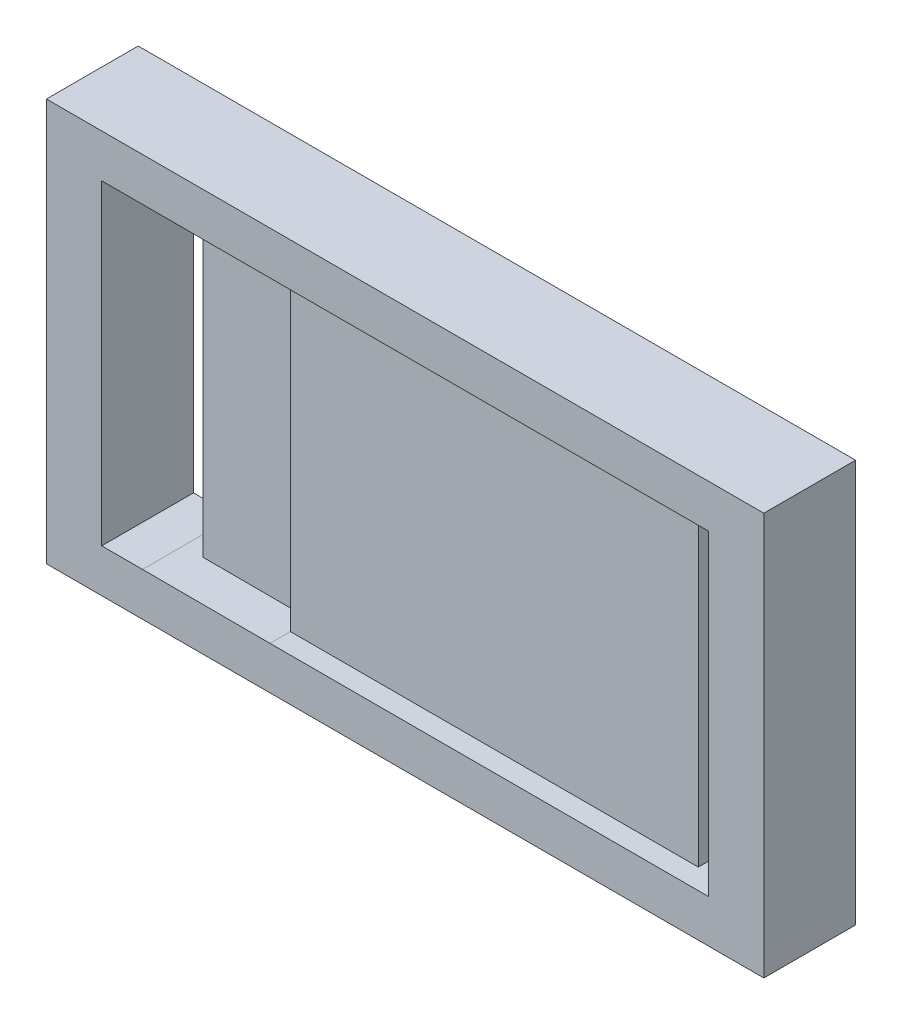
ISO-10303-21;
HEADER;
FILE_DESCRIPTION(('STEP AP214'),'2;1');
FILE_NAME('part.step','',(''),(''),'','','');
FILE_SCHEMA(('AUTOMOTIVE_DESIGN { 1 0 10303 214 1 1 1 1 }'));
ENDSEC;
DATA;
#1=APPLICATION_CONTEXT('core data for automotive mechanical design processes');
#2=APPLICATION_PROTOCOL_DEFINITION('international standard','automotive_design',2000,#1);
#3=PRODUCT_CONTEXT('',#1,'mechanical');
#4=PRODUCT('Part','Part','',(#3));
#5=PRODUCT_RELATED_PRODUCT_CATEGORY('part','',(#4));
#6=PRODUCT_DEFINITION_FORMATION('','',#4);
#7=PRODUCT_DEFINITION_CONTEXT('part definition',#1,'design');
#8=PRODUCT_DEFINITION('design','',#6,#7);
#9=PRODUCT_DEFINITION_SHAPE('','',#8);
#10=(LENGTH_UNIT() NAMED_UNIT(*) SI_UNIT(.MILLI.,.METRE.));
#11=(NAMED_UNIT(*) PLANE_ANGLE_UNIT() SI_UNIT($,.RADIAN.));
#12=(NAMED_UNIT(*) SI_UNIT($,.STERADIAN.) SOLID_ANGLE_UNIT());
#13=UNCERTAINTY_MEASURE_WITH_UNIT(LENGTH_MEASURE(1.E-05),#10,'distance_accuracy_value','');
#14=(GEOMETRIC_REPRESENTATION_CONTEXT(3) GLOBAL_UNCERTAINTY_ASSIGNED_CONTEXT((#13)) GLOBAL_UNIT_ASSIGNED_CONTEXT((#10,
#11,#12)) REPRESENTATION_CONTEXT('',''));
#15=CARTESIAN_POINT('',(0.,0.,0.));
#16=DIRECTION('',(0.,0.,1.));
#17=DIRECTION('',(1.,0.,0.));
#18=AXIS2_PLACEMENT_3D('',#15,#16,#17);
#19=CARTESIAN_POINT('',(-59.5,-31.,-8.));
#20=DIRECTION('',(0.,-1.,0.));
#21=DIRECTION('',(0.,0.,-1.));
#22=AXIS2_PLACEMENT_3D('',#19,#20,#21);
#23=PLANE('',#22);
#24=DIRECTION('',(1.,0.,0.));
#25=VECTOR('',#24,1.);
#26=CARTESIAN_POINT('',(-59.5,-31.,-8.));
#27=LINE('',#26,#25);
#28=CARTESIAN_POINT('',(59.4984198491784,-31.,-8.));
#29=VERTEX_POINT('',#28);
#30=CARTESIAN_POINT('',(59.5,-31.,-8.));
#31=VERTEX_POINT('',#30);
#32=EDGE_CURVE('E263',#29,#31,#27,.T.);
#33=ORIENTED_EDGE('',*,*,#32,.F.);
#34=DIRECTION('',(0.,0.,1.));
#35=VECTOR('',#34,1.);
#36=CARTESIAN_POINT('',(59.4984198491784,-31.,-8.));
#37=LINE('',#36,#35);
#38=CARTESIAN_POINT('',(59.4984198491784,-31.,0.));
#39=VERTEX_POINT('',#38);
#40=EDGE_CURVE('E357',#29,#39,#37,.T.);
#41=ORIENTED_EDGE('',*,*,#40,.T.);
#42=DIRECTION('',(1.,0.,0.));
#43=VECTOR('',#42,1.);
#44=CARTESIAN_POINT('',(59.5,-31.,0.));
#45=LINE('',#44,#43);
#46=CARTESIAN_POINT('',(59.5,-31.,0.));
#47=VERTEX_POINT('',#46);
#48=EDGE_CURVE('E228',#39,#47,#45,.T.);
#49=ORIENTED_EDGE('',*,*,#48,.T.);
#50=DIRECTION('',(0.,0.,1.));
#51=VECTOR('',#50,1.);
#52=CARTESIAN_POINT('',(59.5,-31.,-8.));
#53=LINE('',#52,#51);
#54=EDGE_CURVE('E269',#31,#47,#53,.T.);
#55=ORIENTED_EDGE('',*,*,#54,.F.);
#56=EDGE_LOOP('',(#33,#41,#49,#55));
#57=FACE_BOUND('',#56,.T.);
#58=ADVANCED_FACE('F41',(#57),#23,.F.);
#59=CARTESIAN_POINT('',(0.,0.,0.));
#60=DIRECTION('',(0.,0.,-1.));
#61=DIRECTION('',(-1.,0.,0.));
#62=AXIS2_PLACEMENT_3D('',#59,#60,#61);
#63=PLANE('',#62);
#64=DIRECTION('',(0.,-1.,0.));
#65=VECTOR('',#64,1.);
#66=CARTESIAN_POINT('',(59.4984198491784,0.,0.));
#67=LINE('',#66,#65);
#68=CARTESIAN_POINT('',(59.4984198491784,31.,0.));
#69=VERTEX_POINT('',#68);
#70=EDGE_CURVE('E11',#69,#39,#67,.T.);
#71=ORIENTED_EDGE('',*,*,#70,.F.);
#72=DIRECTION('',(-1.,0.,0.));
#73=VECTOR('',#72,1.);
#74=CARTESIAN_POINT('',(-51.5,31.,0.));
#75=LINE('',#74,#73);
#76=CARTESIAN_POINT('',(59.5,31.,0.));
#77=VERTEX_POINT('',#76);
#78=EDGE_CURVE('E225',#77,#69,#75,.T.);
#79=ORIENTED_EDGE('',*,*,#78,.F.);
#80=DIRECTION('',(0.,1.,0.));
#81=VECTOR('',#80,1.);
#82=CARTESIAN_POINT('',(59.5,31.,0.));
#83=LINE('',#82,#81);
#84=EDGE_CURVE('E232',#47,#77,#83,.T.);
#85=ORIENTED_EDGE('',*,*,#84,.F.);
#86=ORIENTED_EDGE('',*,*,#48,.F.);
#87=EDGE_LOOP('',(#71,#79,#85,#86));
#88=FACE_BOUND('',#87,.T.);
#89=ADVANCED_FACE('F397',(#88),#63,.T.);
#90=CARTESIAN_POINT('',(-47.6036139428101,-31.,0.));
#91=VERTEX_POINT('',#90);
#92=CARTESIAN_POINT('',(53.4984198491784,-31.,0.));
#93=VERTEX_POINT('',#92);
#94=EDGE_CURVE('E229',#91,#93,#45,.T.);
#95=ORIENTED_EDGE('',*,*,#94,.T.);
#96=DIRECTION('',(0.,0.,-1.));
#97=VECTOR('',#96,1.);
#98=CARTESIAN_POINT('',(53.4984198491784,-31.,-8.));
#99=LINE('',#98,#97);
#100=CARTESIAN_POINT('',(53.4984198491784,-31.,-8.));
#101=VERTEX_POINT('',#100);
#102=EDGE_CURVE('E303',#93,#101,#99,.T.);
#103=ORIENTED_EDGE('',*,*,#102,.T.);
#104=CARTESIAN_POINT('',(-47.6036139428101,-31.,-8.));
#105=VERTEX_POINT('',#104);
#106=EDGE_CURVE('E268',#105,#101,#27,.T.);
#107=ORIENTED_EDGE('',*,*,#106,.F.);
#108=DIRECTION('',(0.,0.,1.));
#109=VECTOR('',#108,1.);
#110=CARTESIAN_POINT('',(-47.6036139428101,-31.,-8.));
#111=LINE('',#110,#109);
#112=EDGE_CURVE('E322',#105,#91,#111,.T.);
#113=ORIENTED_EDGE('',*,*,#112,.T.);
#114=EDGE_LOOP('',(#95,#103,#107,#113));
#115=FACE_BOUND('',#114,.T.);
#116=ADVANCED_FACE('F370',(#115),#23,.F.);
#117=DIRECTION('',(0.,0.,-1.));
#118=VECTOR('',#117,1.);
#119=CARTESIAN_POINT('',(-51.5,-31.,10.));
#120=LINE('',#119,#118);
#121=CARTESIAN_POINT('',(-51.5,-31.,10.));
#122=VERTEX_POINT('',#121);
#123=CARTESIAN_POINT('',(-51.5,-31.,-8.));
#124=VERTEX_POINT('',#123);
#125=EDGE_CURVE('E234',#122,#124,#120,.T.);
#126=ORIENTED_EDGE('',*,*,#125,.T.);
#127=CARTESIAN_POINT('',(-59.5,-31.,-8.));
#128=VERTEX_POINT('',#127);
#129=EDGE_CURVE('E264',#128,#124,#27,.T.);
#130=ORIENTED_EDGE('',*,*,#129,.F.);
#131=DIRECTION('',(0.,0.,1.));
#132=VECTOR('',#131,1.);
#133=CARTESIAN_POINT('',(-59.5,-31.,-8.));
#134=LINE('',#133,#132);
#135=CARTESIAN_POINT('',(-59.5,-31.,10.));
#136=VERTEX_POINT('',#135);
#137=EDGE_CURVE('E273',#128,#136,#134,.T.);
#138=ORIENTED_EDGE('',*,*,#137,.T.);
#139=DIRECTION('',(1.,0.,0.));
#140=VECTOR('',#139,1.);
#141=CARTESIAN_POINT('',(-59.5,-31.,10.));
#142=LINE('',#141,#140);
#143=EDGE_CURVE('E240',#136,#122,#142,.T.);
#144=ORIENTED_EDGE('',*,*,#143,.T.);
#145=EDGE_LOOP('',(#126,#130,#138,#144));
#146=FACE_BOUND('',#145,.T.);
#147=ADVANCED_FACE('F390',(#146),#23,.F.);
#148=CARTESIAN_POINT('',(-59.5,31.,-8.));
#149=DIRECTION('',(0.,1.,0.));
#150=DIRECTION('',(0.,0.,1.));
#151=AXIS2_PLACEMENT_3D('',#148,#149,#150);
#152=PLANE('',#151);
#153=DIRECTION('',(0.,0.,1.));
#154=VECTOR('',#153,1.);
#155=CARTESIAN_POINT('',(59.4984198491784,31.,-8.));
#156=LINE('',#155,#154);
#157=CARTESIAN_POINT('',(59.4984198491784,31.,10.));
#158=VERTEX_POINT('',#157);
#159=EDGE_CURVE('E347',#69,#158,#156,.T.);
#160=ORIENTED_EDGE('',*,*,#159,.T.);
#161=DIRECTION('',(-1.,0.,0.));
#162=VECTOR('',#161,1.);
#163=CARTESIAN_POINT('',(-59.5,31.,10.));
#164=LINE('',#163,#162);
#165=CARTESIAN_POINT('',(-59.5,31.,10.));
#166=VERTEX_POINT('',#165);
#167=EDGE_CURVE('E56',#158,#166,#164,.T.);
#168=ORIENTED_EDGE('',*,*,#167,.T.);
#169=DIRECTION('',(0.,0.,1.));
#170=VECTOR('',#169,1.);
#171=CARTESIAN_POINT('',(-59.5,31.,-8.));
#172=LINE('',#171,#170);
#173=CARTESIAN_POINT('',(-59.5,31.,-8.));
#174=VERTEX_POINT('',#173);
#175=EDGE_CURVE('E275',#174,#166,#172,.T.);
#176=ORIENTED_EDGE('',*,*,#175,.F.);
#177=DIRECTION('',(-1.,0.,0.));
#178=VECTOR('',#177,1.);
#179=CARTESIAN_POINT('',(-59.5,31.,-8.));
#180=LINE('',#179,#178);
#181=CARTESIAN_POINT('',(59.5,31.,-8.));
#182=VERTEX_POINT('',#181);
#183=EDGE_CURVE('E258',#182,#174,#180,.T.);
#184=ORIENTED_EDGE('',*,*,#183,.F.);
#185=DIRECTION('',(0.,0.,1.));
#186=VECTOR('',#185,1.);
#187=CARTESIAN_POINT('',(59.5,31.,-8.));
#188=LINE('',#187,#186);
#189=EDGE_CURVE('E267',#182,#77,#188,.T.);
#190=ORIENTED_EDGE('',*,*,#189,.T.);
#191=ORIENTED_EDGE('',*,*,#78,.T.);
#192=EDGE_LOOP('',(#160,#168,#176,#184,#190,#191));
#193=FACE_BOUND('',#192,.T.);
#194=DIRECTION('',(0.,0.,1.));
#195=VECTOR('',#194,1.);
#196=CARTESIAN_POINT('',(-26.5,31.,2.));
#197=LINE('',#196,#195);
#198=CARTESIAN_POINT('',(-26.5,31.,2.));
#199=VERTEX_POINT('',#198);
#200=CARTESIAN_POINT('',(-26.5,31.,6.));
#201=VERTEX_POINT('',#200);
#202=EDGE_CURVE('E216',#199,#201,#197,.T.);
#203=ORIENTED_EDGE('',*,*,#202,.T.);
#204=DIRECTION('',(-1.,0.,0.));
#205=VECTOR('',#204,1.);
#206=CARTESIAN_POINT('',(-26.5,31.,6.));
#207=LINE('',#206,#205);
#208=CARTESIAN_POINT('',(53.4984198491784,31.,6.));
#209=VERTEX_POINT('',#208);
#210=EDGE_CURVE('E198',#209,#201,#207,.T.);
#211=ORIENTED_EDGE('',*,*,#210,.F.);
#212=DIRECTION('',(0.,0.,1.));
#213=VECTOR('',#212,1.);
#214=CARTESIAN_POINT('',(53.4984198491784,31.,-8.));
#215=LINE('',#214,#213);
#216=CARTESIAN_POINT('',(53.4984198491785,31.,0.));
#217=VERTEX_POINT('',#216);
#218=EDGE_CURVE('E64',#217,#209,#215,.T.);
#219=ORIENTED_EDGE('',*,*,#218,.F.);
#220=CARTESIAN_POINT('',(-47.6036139428101,31.,0.));
#221=VERTEX_POINT('',#220);
#222=EDGE_CURVE('E219',#217,#221,#75,.T.);
#223=ORIENTED_EDGE('',*,*,#222,.T.);
#224=DIRECTION('',(0.,0.,1.));
#225=VECTOR('',#224,1.);
#226=CARTESIAN_POINT('',(-47.6036139428101,31.,-8.));
#227=LINE('',#226,#225);
#228=CARTESIAN_POINT('',(-47.6036139428101,31.,2.));
#229=VERTEX_POINT('',#228);
#230=EDGE_CURVE('E312',#221,#229,#227,.T.);
#231=ORIENTED_EDGE('',*,*,#230,.T.);
#232=DIRECTION('',(-1.,0.,0.));
#233=VECTOR('',#232,1.);
#234=CARTESIAN_POINT('',(-51.5,31.,2.));
#235=LINE('',#234,#233);
#236=EDGE_CURVE('E217',#199,#229,#235,.T.);
#237=ORIENTED_EDGE('',*,*,#236,.F.);
#238=EDGE_LOOP('',(#203,#211,#219,#223,#231,#237));
#239=FACE_BOUND('',#238,.T.);
#240=ADVANCED_FACE('F310',(#193,#239),#152,.F.);
#241=CARTESIAN_POINT('',(70.3484198491784,-39.4741318523803,-8.));
#242=DIRECTION('',(1.,0.,0.));
#243=DIRECTION('',(0.,0.,-1.));
#244=AXIS2_PLACEMENT_3D('',#241,#242,#243);
#245=PLANE('',#244);
#246=DIRECTION('',(0.,0.,1.));
#247=VECTOR('',#246,1.);
#248=CARTESIAN_POINT('',(70.3484198491784,39.4741318523803,-8.));
#249=LINE('',#248,#247);
#250=CARTESIAN_POINT('',(70.3484198491784,39.4741318523803,-8.));
#251=VERTEX_POINT('',#250);
#252=CARTESIAN_POINT('',(70.3484198491784,39.4741318523803,10.));
#253=VERTEX_POINT('',#252);
#254=EDGE_CURVE('E291',#251,#253,#249,.T.);
#255=ORIENTED_EDGE('',*,*,#254,.T.);
#256=DIRECTION('',(0.,1.,0.));
#257=VECTOR('',#256,1.);
#258=CARTESIAN_POINT('',(70.3484198491784,-39.4741318523803,10.));
#259=LINE('',#258,#257);
#260=CARTESIAN_POINT('',(70.3484198491784,-39.4741318523803,10.));
#261=VERTEX_POINT('',#260);
#262=EDGE_CURVE('E243',#261,#253,#259,.T.);
#263=ORIENTED_EDGE('',*,*,#262,.F.);
#264=DIRECTION('',(0.,0.,1.));
#265=VECTOR('',#264,1.);
#266=CARTESIAN_POINT('',(70.3484198491784,-39.4741318523803,-8.));
#267=LINE('',#266,#265);
#268=CARTESIAN_POINT('',(70.3484198491784,-39.4741318523803,-8.));
#269=VERTEX_POINT('',#268);
#270=EDGE_CURVE('E292',#269,#261,#267,.T.);
#271=ORIENTED_EDGE('',*,*,#270,.F.);
#272=DIRECTION('',(0.,1.,0.));
#273=VECTOR('',#272,1.);
#274=CARTESIAN_POINT('',(70.3484198491784,-39.4741318523803,-8.));
#275=LINE('',#274,#273);
#276=EDGE_CURVE('E272',#269,#251,#275,.T.);
#277=ORIENTED_EDGE('',*,*,#276,.T.);
#278=EDGE_LOOP('',(#255,#263,#271,#277));
#279=FACE_BOUND('',#278,.T.);
#280=ADVANCED_FACE('F43',(#279),#245,.T.);
#281=CARTESIAN_POINT('',(-70.3484198491784,-39.4741318523803,-8.));
#282=DIRECTION('',(0.,-1.,0.));
#283=DIRECTION('',(0.,0.,-1.));
#284=AXIS2_PLACEMENT_3D('',#281,#282,#283);
#285=PLANE('',#284);
#286=ORIENTED_EDGE('',*,*,#270,.T.);
#287=DIRECTION('',(1.,0.,0.));
#288=VECTOR('',#287,1.);
#289=CARTESIAN_POINT('',(-70.3484198491784,-39.4741318523803,10.));
#290=LINE('',#289,#288);
#291=CARTESIAN_POINT('',(-70.3484198491784,-39.4741318523803,10.));
#292=VERTEX_POINT('',#291);
#293=EDGE_CURVE('E252',#292,#261,#290,.T.);
#294=ORIENTED_EDGE('',*,*,#293,.F.);
#295=DIRECTION('',(0.,0.,1.));
#296=VECTOR('',#295,1.);
#297=CARTESIAN_POINT('',(-70.3484198491784,-39.4741318523803,-8.));
#298=LINE('',#297,#296);
#299=CARTESIAN_POINT('',(-70.3484198491784,-39.4741318523803,-8.));
#300=VERTEX_POINT('',#299);
#301=EDGE_CURVE('E294',#300,#292,#298,.T.);
#302=ORIENTED_EDGE('',*,*,#301,.F.);
#303=DIRECTION('',(1.,0.,0.));
#304=VECTOR('',#303,1.);
#305=CARTESIAN_POINT('',(-70.3484198491784,-39.4741318523803,-8.));
#306=LINE('',#305,#304);
#307=EDGE_CURVE('E288',#300,#269,#306,.T.);
#308=ORIENTED_EDGE('',*,*,#307,.T.);
#309=EDGE_LOOP('',(#286,#294,#302,#308));
#310=FACE_BOUND('',#309,.T.);
#311=ADVANCED_FACE('F427',(#310),#285,.T.);
#312=CARTESIAN_POINT('',(-70.3484198491784,-39.4741318523803,-8.));
#313=DIRECTION('',(-1.,0.,0.));
#314=DIRECTION('',(0.,0.,1.));
#315=AXIS2_PLACEMENT_3D('',#312,#313,#314);
#316=PLANE('',#315);
#317=ORIENTED_EDGE('',*,*,#301,.T.);
#318=DIRECTION('',(0.,-1.,0.));
#319=VECTOR('',#318,1.);
#320=CARTESIAN_POINT('',(-70.3484198491784,-39.4741318523803,10.));
#321=LINE('',#320,#319);
#322=CARTESIAN_POINT('',(-70.3484198491784,39.4741318523803,10.));
#323=VERTEX_POINT('',#322);
#324=EDGE_CURVE('E249',#323,#292,#321,.T.);
#325=ORIENTED_EDGE('',*,*,#324,.F.);
#326=DIRECTION('',(0.,0.,1.));
#327=VECTOR('',#326,1.);
#328=CARTESIAN_POINT('',(-70.3484198491784,39.4741318523803,-8.));
#329=LINE('',#328,#327);
#330=CARTESIAN_POINT('',(-70.3484198491784,39.4741318523803,-8.));
#331=VERTEX_POINT('',#330);
#332=EDGE_CURVE('E296',#331,#323,#329,.T.);
#333=ORIENTED_EDGE('',*,*,#332,.F.);
#334=DIRECTION('',(0.,-1.,0.));
#335=VECTOR('',#334,1.);
#336=CARTESIAN_POINT('',(-70.3484198491784,-39.4741318523803,-8.));
#337=LINE('',#336,#335);
#338=EDGE_CURVE('E285',#331,#300,#337,.T.);
#339=ORIENTED_EDGE('',*,*,#338,.T.);
#340=EDGE_LOOP('',(#317,#325,#333,#339));
#341=FACE_BOUND('',#340,.T.);
#342=ADVANCED_FACE('F430',(#341),#316,.T.);
#343=CARTESIAN_POINT('',(-70.3484198491784,39.4741318523803,-8.));
#344=DIRECTION('',(0.,1.,0.));
#345=DIRECTION('',(0.,0.,1.));
#346=AXIS2_PLACEMENT_3D('',#343,#344,#345);
#347=PLANE('',#346);
#348=ORIENTED_EDGE('',*,*,#332,.T.);
#349=DIRECTION('',(-1.,0.,0.));
#350=VECTOR('',#349,1.);
#351=CARTESIAN_POINT('',(-70.3484198491784,39.4741318523803,10.));
#352=LINE('',#351,#350);
#353=EDGE_CURVE('E246',#253,#323,#352,.T.);
#354=ORIENTED_EDGE('',*,*,#353,.F.);
#355=ORIENTED_EDGE('',*,*,#254,.F.);
#356=DIRECTION('',(-1.,0.,0.));
#357=VECTOR('',#356,1.);
#358=CARTESIAN_POINT('',(-70.3484198491784,39.4741318523803,-8.));
#359=LINE('',#358,#357);
#360=EDGE_CURVE('E282',#251,#331,#359,.T.);
#361=ORIENTED_EDGE('',*,*,#360,.T.);
#362=EDGE_LOOP('',(#348,#354,#355,#361));
#363=FACE_BOUND('',#362,.T.);
#364=ADVANCED_FACE('F426',(#363),#347,.T.);
#365=CARTESIAN_POINT('',(0.,0.,-8.));
#366=DIRECTION('',(0.,0.,-1.));
#367=DIRECTION('',(-1.,0.,0.));
#368=AXIS2_PLACEMENT_3D('',#365,#366,#367);
#369=PLANE('',#368);
#370=DIRECTION('',(0.,1.,0.));
#371=VECTOR('',#370,1.);
#372=CARTESIAN_POINT('',(59.4984198491784,31.,-8.));
#373=LINE('',#372,#371);
#374=CARTESIAN_POINT('',(59.4984198491784,-31.0615588520916,-8.));
#375=VERTEX_POINT('',#374);
#376=EDGE_CURVE('E337',#375,#29,#373,.T.);
#377=ORIENTED_EDGE('',*,*,#376,.T.);
#378=ORIENTED_EDGE('',*,*,#32,.T.);
#379=DIRECTION('',(0.,1.,0.));
#380=VECTOR('',#379,1.);
#381=CARTESIAN_POINT('',(59.5,-31.,-8.));
#382=LINE('',#381,#380);
#383=EDGE_CURVE('E255',#31,#182,#382,.T.);
#384=ORIENTED_EDGE('',*,*,#383,.T.);
#385=ORIENTED_EDGE('',*,*,#183,.T.);
#386=DIRECTION('',(0.,-1.,0.));
#387=VECTOR('',#386,1.);
#388=CARTESIAN_POINT('',(-59.5,-31.,-8.));
#389=LINE('',#388,#387);
#390=EDGE_CURVE('E260',#174,#128,#389,.T.);
#391=ORIENTED_EDGE('',*,*,#390,.T.);
#392=ORIENTED_EDGE('',*,*,#129,.T.);
#393=DIRECTION('',(0.999996968419969,-0.00246234661883823,0.));
#394=VECTOR('',#393,1.);
#395=CARTESIAN_POINT('',(-47.6036139428101,-31.0095942821195,-8.));
#396=LINE('',#395,#394);
#397=CARTESIAN_POINT('',(-47.6036139428101,-31.0095942821195,-8.));
#398=VERTEX_POINT('',#397);
#399=EDGE_CURVE('E360',#124,#398,#396,.T.);
#400=ORIENTED_EDGE('',*,*,#399,.T.);
#401=DIRECTION('',(0.,1.,0.));
#402=VECTOR('',#401,1.);
#403=CARTESIAN_POINT('',(-47.6036139428101,31.,-8.));
#404=LINE('',#403,#402);
#405=EDGE_CURVE('E324',#398,#105,#404,.T.);
#406=ORIENTED_EDGE('',*,*,#405,.T.);
#407=ORIENTED_EDGE('',*,*,#106,.T.);
#408=DIRECTION('',(0.,-1.,0.));
#409=VECTOR('',#408,1.);
#410=CARTESIAN_POINT('',(53.4984198491784,-31.0615588520916,-8.));
#411=LINE('',#410,#409);
#412=CARTESIAN_POINT('',(53.4984198491784,-31.0615588520916,-8.));
#413=VERTEX_POINT('',#412);
#414=EDGE_CURVE('E340',#101,#413,#411,.T.);
#415=ORIENTED_EDGE('',*,*,#414,.T.);
#416=DIRECTION('',(1.,0.,0.));
#417=VECTOR('',#416,1.);
#418=CARTESIAN_POINT('',(59.4984198491784,-31.0615588520916,-8.));
#419=LINE('',#418,#417);
#420=EDGE_CURVE('E344',#413,#375,#419,.T.);
#421=ORIENTED_EDGE('',*,*,#420,.T.);
#422=EDGE_LOOP('',(#377,#378,#384,#385,#391,#392,#400,#406,#407,#415,#421));
#423=FACE_BOUND('',#422,.T.);
#424=ORIENTED_EDGE('',*,*,#276,.F.);
#425=ORIENTED_EDGE('',*,*,#307,.F.);
#426=ORIENTED_EDGE('',*,*,#338,.F.);
#427=ORIENTED_EDGE('',*,*,#360,.F.);
#428=EDGE_LOOP('',(#424,#425,#426,#427));
#429=FACE_BOUND('',#428,.T.);
#430=ADVANCED_FACE('F366',(#423,#429),#369,.T.);
#431=CARTESIAN_POINT('',(59.5,-31.,-8.));
#432=DIRECTION('',(1.,0.,0.));
#433=DIRECTION('',(0.,0.,-1.));
#434=AXIS2_PLACEMENT_3D('',#431,#432,#433);
#435=PLANE('',#434);
#436=ORIENTED_EDGE('',*,*,#54,.T.);
#437=ORIENTED_EDGE('',*,*,#84,.T.);
#438=ORIENTED_EDGE('',*,*,#189,.F.);
#439=ORIENTED_EDGE('',*,*,#383,.F.);
#440=EDGE_LOOP('',(#436,#437,#438,#439));
#441=FACE_BOUND('',#440,.T.);
#442=ADVANCED_FACE('F379',(#441),#435,.F.);
#443=CARTESIAN_POINT('',(-59.5,-31.,-8.));
#444=DIRECTION('',(-1.,0.,0.));
#445=DIRECTION('',(0.,0.,1.));
#446=AXIS2_PLACEMENT_3D('',#443,#444,#445);
#447=PLANE('',#446);
#448=ORIENTED_EDGE('',*,*,#175,.T.);
#449=DIRECTION('',(0.,-1.,0.));
#450=VECTOR('',#449,1.);
#451=CARTESIAN_POINT('',(-59.5,-31.,10.));
#452=LINE('',#451,#450);
#453=EDGE_CURVE('E237',#166,#136,#452,.T.);
#454=ORIENTED_EDGE('',*,*,#453,.T.);
#455=ORIENTED_EDGE('',*,*,#137,.F.);
#456=ORIENTED_EDGE('',*,*,#390,.F.);
#457=EDGE_LOOP('',(#448,#454,#455,#456));
#458=FACE_BOUND('',#457,.T.);
#459=ADVANCED_FACE('F386',(#458),#447,.F.);
#460=CARTESIAN_POINT('',(0.,0.,10.));
#461=DIRECTION('',(0.,0.,-1.));
#462=DIRECTION('',(-1.,0.,0.));
#463=AXIS2_PLACEMENT_3D('',#460,#461,#462);
#464=PLANE('',#463);
#465=ORIENTED_EDGE('',*,*,#167,.F.);
#466=DIRECTION('',(0.,1.,0.));
#467=VECTOR('',#466,1.);
#468=CARTESIAN_POINT('',(59.4984198491784,31.,10.));
#469=LINE('',#468,#467);
#470=CARTESIAN_POINT('',(59.4984198491784,-31.0615588520916,10.));
#471=VERTEX_POINT('',#470);
#472=EDGE_CURVE('E211',#471,#158,#469,.T.);
#473=ORIENTED_EDGE('',*,*,#472,.F.);
#474=DIRECTION('',(1.,0.,0.));
#475=VECTOR('',#474,1.);
#476=CARTESIAN_POINT('',(59.4984198491784,-31.0615588520916,10.));
#477=LINE('',#476,#475);
#478=CARTESIAN_POINT('',(-26.5,-31.0615588520916,10.));
#479=VERTEX_POINT('',#478);
#480=EDGE_CURVE('E341',#479,#471,#477,.T.);
#481=ORIENTED_EDGE('',*,*,#480,.F.);
#482=DIRECTION('',(0.999996968419969,-0.00246234661883852,0.));
#483=VECTOR('',#482,1.);
#484=CARTESIAN_POINT('',(-26.5,-31.0615588520916,10.));
#485=LINE('',#484,#483);
#486=EDGE_CURVE('E210',#122,#479,#485,.T.);
#487=ORIENTED_EDGE('',*,*,#486,.F.);
#488=ORIENTED_EDGE('',*,*,#143,.F.);
#489=ORIENTED_EDGE('',*,*,#453,.F.);
#490=EDGE_LOOP('',(#465,#473,#481,#487,#488,#489));
#491=FACE_BOUND('',#490,.T.);
#492=ORIENTED_EDGE('',*,*,#262,.T.);
#493=ORIENTED_EDGE('',*,*,#353,.T.);
#494=ORIENTED_EDGE('',*,*,#324,.T.);
#495=ORIENTED_EDGE('',*,*,#293,.T.);
#496=EDGE_LOOP('',(#492,#493,#494,#495));
#497=FACE_BOUND('',#496,.T.);
#498=ADVANCED_FACE('F391',(#491,#497),#464,.F.);
#499=DIRECTION('',(0.,1.,0.));
#500=VECTOR('',#499,1.);
#501=CARTESIAN_POINT('',(53.4984198491784,0.,0.));
#502=LINE('',#501,#500);
#503=EDGE_CURVE('E49',#93,#217,#502,.T.);
#504=ORIENTED_EDGE('',*,*,#503,.F.);
#505=ORIENTED_EDGE('',*,*,#94,.F.);
#506=DIRECTION('',(0.,-1.,0.));
#507=VECTOR('',#506,1.);
#508=CARTESIAN_POINT('',(-47.6036139428101,0.,0.));
#509=LINE('',#508,#507);
#510=EDGE_CURVE('E308',#221,#91,#509,.T.);
#511=ORIENTED_EDGE('',*,*,#510,.F.);
#512=ORIENTED_EDGE('',*,*,#222,.F.);
#513=EDGE_LOOP('',(#504,#505,#511,#512));
#514=FACE_BOUND('',#513,.T.);
#515=ADVANCED_FACE('F307',(#514),#63,.T.);
#516=CARTESIAN_POINT('',(-26.5,31.,2.));
#517=DIRECTION('',(1.,0.,0.));
#518=DIRECTION('',(0.,1.,0.));
#519=AXIS2_PLACEMENT_3D('',#516,#517,#518);
#520=PLANE('',#519);
#521=DIRECTION('',(0.,0.,1.));
#522=VECTOR('',#521,1.);
#523=CARTESIAN_POINT('',(-26.5,-31.0615588520916,2.));
#524=LINE('',#523,#522);
#525=CARTESIAN_POINT('',(-26.5,-31.0615588520916,2.));
#526=VERTEX_POINT('',#525);
#527=CARTESIAN_POINT('',(-26.5,-31.0615588520916,6.));
#528=VERTEX_POINT('',#527);
#529=EDGE_CURVE('E207',#526,#528,#524,.T.);
#530=ORIENTED_EDGE('',*,*,#529,.T.);
#531=DIRECTION('',(0.,-1.,0.));
#532=VECTOR('',#531,1.);
#533=CARTESIAN_POINT('',(-26.5,-31.0615588520916,6.));
#534=LINE('',#533,#532);
#535=EDGE_CURVE('E194',#201,#528,#534,.T.);
#536=ORIENTED_EDGE('',*,*,#535,.F.);
#537=ORIENTED_EDGE('',*,*,#202,.F.);
#538=DIRECTION('',(0.,1.,0.));
#539=VECTOR('',#538,1.);
#540=CARTESIAN_POINT('',(-26.5,31.,2.));
#541=LINE('',#540,#539);
#542=EDGE_CURVE('E215',#526,#199,#541,.T.);
#543=ORIENTED_EDGE('',*,*,#542,.F.);
#544=EDGE_LOOP('',(#530,#536,#537,#543));
#545=FACE_BOUND('',#544,.T.);
#546=ADVANCED_FACE('F213',(#545),#520,.F.);
#547=CARTESIAN_POINT('',(-26.5,-31.0615588520916,2.));
#548=DIRECTION('',(-0.00246234661883852,-0.999996968419969,0.));
#549=DIRECTION('',(0.999996968419969,-0.00246234661883852,0.));
#550=AXIS2_PLACEMENT_3D('',#547,#548,#549);
#551=PLANE('',#550);
#552=ORIENTED_EDGE('',*,*,#486,.T.);
#553=DIRECTION('',(0.,0.,1.));
#554=VECTOR('',#553,1.);
#555=CARTESIAN_POINT('',(-26.5,-31.0615588520916,6.));
#556=LINE('',#555,#554);
#557=EDGE_CURVE('E187',#528,#479,#556,.T.);
#558=ORIENTED_EDGE('',*,*,#557,.F.);
#559=ORIENTED_EDGE('',*,*,#529,.F.);
#560=DIRECTION('',(0.999996968419969,-0.00246234661883852,0.));
#561=VECTOR('',#560,1.);
#562=CARTESIAN_POINT('',(-26.5,-31.0615588520916,2.));
#563=LINE('',#562,#561);
#564=CARTESIAN_POINT('',(-47.6036139428101,-31.0095942821195,2.));
#565=VERTEX_POINT('',#564);
#566=EDGE_CURVE('E330',#565,#526,#563,.T.);
#567=ORIENTED_EDGE('',*,*,#566,.F.);
#568=DIRECTION('',(0.,0.,1.));
#569=VECTOR('',#568,1.);
#570=CARTESIAN_POINT('',(-47.6036139428101,-31.0095942821195,-8.));
#571=LINE('',#570,#569);
#572=EDGE_CURVE('E320',#398,#565,#571,.T.);
#573=ORIENTED_EDGE('',*,*,#572,.F.);
#574=ORIENTED_EDGE('',*,*,#399,.F.);
#575=ORIENTED_EDGE('',*,*,#125,.F.);
#576=EDGE_LOOP('',(#552,#558,#559,#567,#573,#574,#575));
#577=FACE_BOUND('',#576,.T.);
#578=ADVANCED_FACE('F205',(#577),#551,.F.);
#579=CARTESIAN_POINT('',(0.,0.,2.));
#580=DIRECTION('',(0.,0.,-1.));
#581=DIRECTION('',(-1.,0.,0.));
#582=AXIS2_PLACEMENT_3D('',#579,#580,#581);
#583=PLANE('',#582);
#584=ORIENTED_EDGE('',*,*,#236,.T.);
#585=DIRECTION('',(0.,1.,0.));
#586=VECTOR('',#585,1.);
#587=CARTESIAN_POINT('',(-47.6036139428101,31.,2.));
#588=LINE('',#587,#586);
#589=EDGE_CURVE('E319',#565,#229,#588,.T.);
#590=ORIENTED_EDGE('',*,*,#589,.F.);
#591=ORIENTED_EDGE('',*,*,#566,.T.);
#592=ORIENTED_EDGE('',*,*,#542,.T.);
#593=EDGE_LOOP('',(#584,#590,#591,#592));
#594=FACE_BOUND('',#593,.T.);
#595=ADVANCED_FACE('F333',(#594),#583,.F.);
#596=CARTESIAN_POINT('',(-47.6036139428101,31.,-8.));
#597=DIRECTION('',(1.,0.,0.));
#598=DIRECTION('',(0.,0.,-1.));
#599=AXIS2_PLACEMENT_3D('',#596,#597,#598);
#600=PLANE('',#599);
#601=ORIENTED_EDGE('',*,*,#405,.F.);
#602=ORIENTED_EDGE('',*,*,#572,.T.);
#603=ORIENTED_EDGE('',*,*,#589,.T.);
#604=ORIENTED_EDGE('',*,*,#230,.F.);
#605=ORIENTED_EDGE('',*,*,#510,.T.);
#606=ORIENTED_EDGE('',*,*,#112,.F.);
#607=EDGE_LOOP('',(#601,#602,#603,#604,#605,#606));
#608=FACE_BOUND('',#607,.T.);
#609=ADVANCED_FACE('F316',(#608),#600,.F.);
#610=CARTESIAN_POINT('',(59.4984198491784,31.,-8.));
#611=DIRECTION('',(1.,0.,0.));
#612=DIRECTION('',(0.,1.,0.));
#613=AXIS2_PLACEMENT_3D('',#610,#611,#612);
#614=PLANE('',#613);
#615=ORIENTED_EDGE('',*,*,#376,.F.);
#616=DIRECTION('',(0.,0.,1.));
#617=VECTOR('',#616,1.);
#618=CARTESIAN_POINT('',(59.4984198491784,-31.0615588520916,-8.));
#619=LINE('',#618,#617);
#620=EDGE_CURVE('E350',#375,#471,#619,.T.);
#621=ORIENTED_EDGE('',*,*,#620,.T.);
#622=ORIENTED_EDGE('',*,*,#472,.T.);
#623=ORIENTED_EDGE('',*,*,#159,.F.);
#624=ORIENTED_EDGE('',*,*,#70,.T.);
#625=ORIENTED_EDGE('',*,*,#40,.F.);
#626=EDGE_LOOP('',(#615,#621,#622,#623,#624,#625));
#627=FACE_BOUND('',#626,.T.);
#628=ADVANCED_FACE('F394',(#627),#614,.F.);
#629=CARTESIAN_POINT('',(53.4984198491784,-31.0615588520916,-8.));
#630=DIRECTION('',(-1.,0.,0.));
#631=DIRECTION('',(0.,0.,1.));
#632=AXIS2_PLACEMENT_3D('',#629,#630,#631);
#633=PLANE('',#632);
#634=ORIENTED_EDGE('',*,*,#218,.T.);
#635=DIRECTION('',(0.,1.,0.));
#636=VECTOR('',#635,1.);
#637=CARTESIAN_POINT('',(53.4984198491784,31.,6.));
#638=LINE('',#637,#636);
#639=CARTESIAN_POINT('',(53.4984198491784,-31.0615588520916,6.));
#640=VERTEX_POINT('',#639);
#641=EDGE_CURVE('E193',#640,#209,#638,.T.);
#642=ORIENTED_EDGE('',*,*,#641,.F.);
#643=DIRECTION('',(0.,0.,1.));
#644=VECTOR('',#643,1.);
#645=CARTESIAN_POINT('',(53.4984198491784,-31.0615588520916,-8.));
#646=LINE('',#645,#644);
#647=EDGE_CURVE('E190',#413,#640,#646,.T.);
#648=ORIENTED_EDGE('',*,*,#647,.F.);
#649=ORIENTED_EDGE('',*,*,#414,.F.);
#650=ORIENTED_EDGE('',*,*,#102,.F.);
#651=ORIENTED_EDGE('',*,*,#503,.T.);
#652=EDGE_LOOP('',(#634,#642,#648,#649,#650,#651));
#653=FACE_BOUND('',#652,.T.);
#654=ADVANCED_FACE('F301',(#653),#633,.F.);
#655=CARTESIAN_POINT('',(59.4984198491784,-31.0615588520916,-8.));
#656=DIRECTION('',(0.,-1.,0.));
#657=DIRECTION('',(1.,0.,0.));
#658=AXIS2_PLACEMENT_3D('',#655,#656,#657);
#659=PLANE('',#658);
#660=ORIENTED_EDGE('',*,*,#480,.T.);
#661=ORIENTED_EDGE('',*,*,#620,.F.);
#662=ORIENTED_EDGE('',*,*,#420,.F.);
#663=ORIENTED_EDGE('',*,*,#647,.T.);
#664=DIRECTION('',(1.,0.,0.));
#665=VECTOR('',#664,1.);
#666=CARTESIAN_POINT('',(53.4984198491784,-31.0615588520916,6.));
#667=LINE('',#666,#665);
#668=EDGE_CURVE('E182',#528,#640,#667,.T.);
#669=ORIENTED_EDGE('',*,*,#668,.F.);
#670=ORIENTED_EDGE('',*,*,#557,.T.);
#671=EDGE_LOOP('',(#660,#661,#662,#663,#669,#670));
#672=FACE_BOUND('',#671,.T.);
#673=ADVANCED_FACE('F185',(#672),#659,.F.);
#674=CARTESIAN_POINT('',(0.,0.,6.));
#675=DIRECTION('',(0.,0.,-1.));
#676=DIRECTION('',(-1.,0.,0.));
#677=AXIS2_PLACEMENT_3D('',#674,#675,#676);
#678=PLANE('',#677);
#679=ORIENTED_EDGE('',*,*,#535,.T.);
#680=ORIENTED_EDGE('',*,*,#668,.T.);
#681=ORIENTED_EDGE('',*,*,#641,.T.);
#682=ORIENTED_EDGE('',*,*,#210,.T.);
#683=EDGE_LOOP('',(#679,#680,#681,#682));
#684=FACE_BOUND('',#683,.T.);
#685=ADVANCED_FACE('F197',(#684),#678,.F.);
#686=CLOSED_SHELL('',(#58,#89,#116,#147,#240,#280,#311,#342,#364,#430,#442,#459,#498,#515,#546,
#578,#595,#609,#628,#654,#673,#685));
#687=MANIFOLD_SOLID_BREP('B2',#686);
#688=ADVANCED_BREP_SHAPE_REPRESENTATION('',(#18,#687),#14);
#689=SHAPE_DEFINITION_REPRESENTATION(#9,#688);
ENDSEC;
END-ISO-10303-21;
